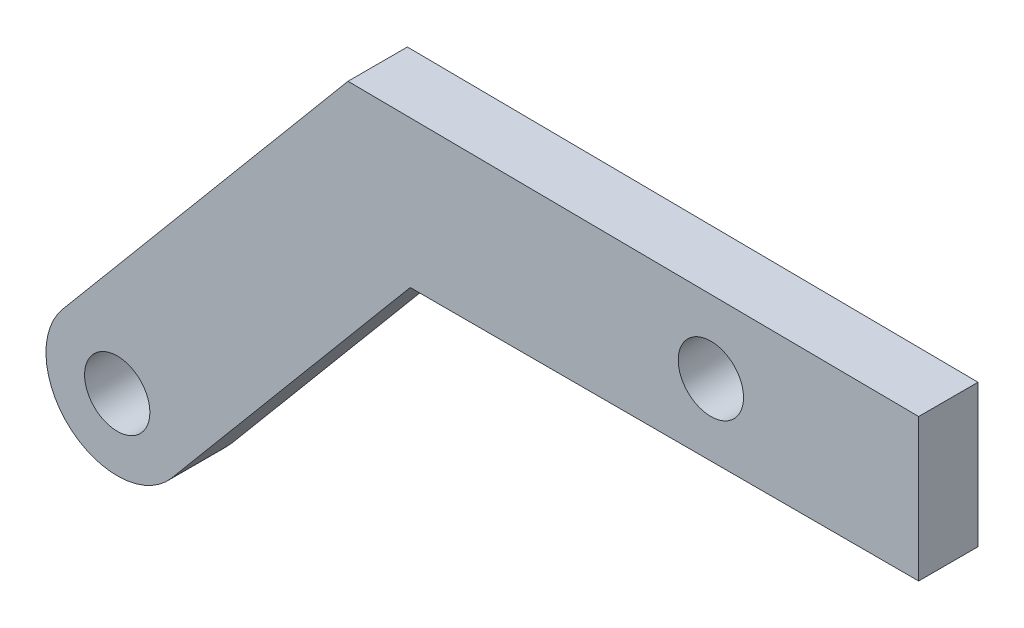
ISO-10303-21;
HEADER;
FILE_DESCRIPTION(('STEP AP214'),'2;1');
FILE_NAME('part.step','',(''),(''),'','','');
FILE_SCHEMA(('AUTOMOTIVE_DESIGN { 1 0 10303 214 1 1 1 1 }'));
ENDSEC;
DATA;
#1=APPLICATION_CONTEXT('core data for automotive mechanical design processes');
#2=APPLICATION_PROTOCOL_DEFINITION('international standard','automotive_design',2000,#1);
#3=PRODUCT_CONTEXT('',#1,'mechanical');
#4=PRODUCT('Part','Part','',(#3));
#5=PRODUCT_RELATED_PRODUCT_CATEGORY('part','',(#4));
#6=PRODUCT_DEFINITION_FORMATION('','',#4);
#7=PRODUCT_DEFINITION_CONTEXT('part definition',#1,'design');
#8=PRODUCT_DEFINITION('design','',#6,#7);
#9=PRODUCT_DEFINITION_SHAPE('','',#8);
#10=(LENGTH_UNIT() NAMED_UNIT(*) SI_UNIT(.MILLI.,.METRE.));
#11=(NAMED_UNIT(*) PLANE_ANGLE_UNIT() SI_UNIT($,.RADIAN.));
#12=(NAMED_UNIT(*) SI_UNIT($,.STERADIAN.) SOLID_ANGLE_UNIT());
#13=UNCERTAINTY_MEASURE_WITH_UNIT(LENGTH_MEASURE(1.E-05),#10,'distance_accuracy_value','');
#14=(GEOMETRIC_REPRESENTATION_CONTEXT(3) GLOBAL_UNCERTAINTY_ASSIGNED_CONTEXT((#13)) GLOBAL_UNIT_ASSIGNED_CONTEXT((#10,
#11,#12)) REPRESENTATION_CONTEXT('',''));
#15=CARTESIAN_POINT('',(0.,0.,0.));
#16=DIRECTION('',(0.,0.,1.));
#17=DIRECTION('',(1.,0.,0.));
#18=AXIS2_PLACEMENT_3D('',#15,#16,#17);
#19=CARTESIAN_POINT('',(0.,0.,10.));
#20=DIRECTION('',(0.,0.,1.));
#21=DIRECTION('',(1.,0.,0.));
#22=AXIS2_PLACEMENT_3D('',#19,#20,#21);
#23=PLANE('',#22);
#24=CARTESIAN_POINT('',(0.,0.,10.));
#25=DIRECTION('',(0.,0.,1.));
#26=DIRECTION('',(1.,0.,0.));
#27=AXIS2_PLACEMENT_3D('',#24,#25,#26);
#28=CIRCLE('',#27,5.5);
#29=CARTESIAN_POINT('',(5.5,0.,10.));
#30=VERTEX_POINT('',#29);
#31=EDGE_CURVE('E126',#30,#30,#28,.T.);
#32=ORIENTED_EDGE('',*,*,#31,.F.);
#33=EDGE_LOOP('',(#32));
#34=FACE_BOUND('',#33,.T.);
#35=CARTESIAN_POINT('',(0.,0.,10.));
#36=DIRECTION('',(0.,0.,1.));
#37=DIRECTION('',(1.,0.,0.));
#38=AXIS2_PLACEMENT_3D('',#35,#36,#37);
#39=CIRCLE('',#38,12.);
#40=CARTESIAN_POINT('',(-9.19253331742775,7.71345131623845,10.));
#41=VERTEX_POINT('',#40);
#42=CARTESIAN_POINT('',(9.19253331742775,-7.71345131623846,10.));
#43=VERTEX_POINT('',#42);
#44=EDGE_CURVE('E134',#41,#43,#39,.T.);
#45=ORIENTED_EDGE('',*,*,#44,.T.);
#46=DIRECTION('',(0.642787609686538,0.766044443118979,0.));
#47=VECTOR('',#46,1.);
#48=CARTESIAN_POINT('',(9.19253331742775,-7.71345131623846,10.));
#49=LINE('',#48,#47);
#50=CARTESIAN_POINT('',(49.357211477239,40.1529481761069,10.));
#51=VERTEX_POINT('',#50);
#52=EDGE_CURVE('E93',#43,#51,#49,.T.);
#53=ORIENTED_EDGE('',*,*,#52,.T.);
#54=DIRECTION('',(1.,0.,0.));
#55=VECTOR('',#54,1.);
#56=CARTESIAN_POINT('',(135.,40.152948176107,10.));
#57=LINE('',#56,#55);
#58=CARTESIAN_POINT('',(135.,40.152948176107,10.));
#59=VERTEX_POINT('',#58);
#60=EDGE_CURVE('E106',#51,#59,#57,.T.);
#61=ORIENTED_EDGE('',*,*,#60,.T.);
#62=DIRECTION('',(0.,1.,0.));
#63=VECTOR('',#62,1.);
#64=CARTESIAN_POINT('',(135.,64.1529481761069,10.));
#65=LINE('',#64,#63);
#66=CARTESIAN_POINT('',(135.,64.1529481761069,10.));
#67=VERTEX_POINT('',#66);
#68=EDGE_CURVE('E99',#59,#67,#65,.T.);
#69=ORIENTED_EDGE('',*,*,#68,.T.);
#70=DIRECTION('',(-0.9999611754595,0.00881178606499798,0.));
#71=VECTOR('',#70,1.);
#72=CARTESIAN_POINT('',(38.8765885545357,65.,10.));
#73=LINE('',#72,#71);
#74=CARTESIAN_POINT('',(38.8765885545357,65.,10.));
#75=VERTEX_POINT('',#74);
#76=EDGE_CURVE('E101',#67,#75,#73,.T.);
#77=ORIENTED_EDGE('',*,*,#76,.T.);
#78=DIRECTION('',(-0.642787609686538,-0.766044443118979,0.));
#79=VECTOR('',#78,1.);
#80=CARTESIAN_POINT('',(-9.19253331742775,7.71345131623845,10.));
#81=LINE('',#80,#79);
#82=EDGE_CURVE('E57',#75,#41,#81,.T.);
#83=ORIENTED_EDGE('',*,*,#82,.T.);
#84=EDGE_LOOP('',(#45,#53,#61,#69,#77,#83));
#85=FACE_BOUND('',#84,.T.);
#86=CARTESIAN_POINT('',(100.,52.152948176107,10.));
#87=DIRECTION('',(0.,0.,1.));
#88=DIRECTION('',(1.,0.,0.));
#89=AXIS2_PLACEMENT_3D('',#86,#87,#88);
#90=CIRCLE('',#89,5.5);
#91=CARTESIAN_POINT('',(105.5,52.152948176107,10.));
#92=VERTEX_POINT('',#91);
#93=EDGE_CURVE('E180',#92,#92,#90,.T.);
#94=ORIENTED_EDGE('',*,*,#93,.F.);
#95=EDGE_LOOP('',(#94));
#96=FACE_BOUND('',#95,.T.);
#97=ADVANCED_FACE('F39',(#34,#85,#96),#23,.T.);
#98=CARTESIAN_POINT('',(0.,0.,0.));
#99=DIRECTION('',(0.,0.,1.));
#100=DIRECTION('',(1.,0.,0.));
#101=AXIS2_PLACEMENT_3D('',#98,#99,#100);
#102=PLANE('',#101);
#103=CARTESIAN_POINT('',(0.,0.,0.));
#104=DIRECTION('',(0.,0.,1.));
#105=DIRECTION('',(1.,0.,0.));
#106=AXIS2_PLACEMENT_3D('',#103,#104,#105);
#107=CIRCLE('',#106,12.);
#108=CARTESIAN_POINT('',(-9.19253331742775,7.71345131623845,0.));
#109=VERTEX_POINT('',#108);
#110=CARTESIAN_POINT('',(9.19253331742775,-7.71345131623846,0.));
#111=VERTEX_POINT('',#110);
#112=EDGE_CURVE('E125',#109,#111,#107,.T.);
#113=ORIENTED_EDGE('',*,*,#112,.F.);
#114=DIRECTION('',(-0.642787609686538,-0.766044443118979,0.));
#115=VECTOR('',#114,1.);
#116=CARTESIAN_POINT('',(-9.19253331742775,7.71345131623845,0.));
#117=LINE('',#116,#115);
#118=CARTESIAN_POINT('',(38.8765885545357,65.,0.));
#119=VERTEX_POINT('',#118);
#120=EDGE_CURVE('E82',#119,#109,#117,.T.);
#121=ORIENTED_EDGE('',*,*,#120,.F.);
#122=DIRECTION('',(-0.9999611754595,0.00881178606499798,0.));
#123=VECTOR('',#122,1.);
#124=CARTESIAN_POINT('',(38.8765885545357,65.,0.));
#125=LINE('',#124,#123);
#126=CARTESIAN_POINT('',(135.,64.1529481761069,0.));
#127=VERTEX_POINT('',#126);
#128=EDGE_CURVE('E80',#127,#119,#125,.T.);
#129=ORIENTED_EDGE('',*,*,#128,.F.);
#130=DIRECTION('',(0.,1.,0.));
#131=VECTOR('',#130,1.);
#132=CARTESIAN_POINT('',(135.,64.1529481761069,0.));
#133=LINE('',#132,#131);
#134=CARTESIAN_POINT('',(135.,40.152948176107,0.));
#135=VERTEX_POINT('',#134);
#136=EDGE_CURVE('E114',#135,#127,#133,.T.);
#137=ORIENTED_EDGE('',*,*,#136,.F.);
#138=DIRECTION('',(1.,0.,0.));
#139=VECTOR('',#138,1.);
#140=CARTESIAN_POINT('',(135.,40.152948176107,0.));
#141=LINE('',#140,#139);
#142=CARTESIAN_POINT('',(49.357211477239,40.1529481761069,0.));
#143=VERTEX_POINT('',#142);
#144=EDGE_CURVE('E127',#143,#135,#141,.T.);
#145=ORIENTED_EDGE('',*,*,#144,.F.);
#146=DIRECTION('',(0.642787609686538,0.766044443118979,0.));
#147=VECTOR('',#146,1.);
#148=CARTESIAN_POINT('',(39.7116071613007,28.6577645798453,0.));
#149=LINE('',#148,#147);
#150=EDGE_CURVE('E130',#111,#143,#149,.T.);
#151=ORIENTED_EDGE('',*,*,#150,.F.);
#152=EDGE_LOOP('',(#113,#121,#129,#137,#145,#151));
#153=FACE_BOUND('',#152,.T.);
#154=CARTESIAN_POINT('',(0.,0.,0.));
#155=DIRECTION('',(0.,0.,1.));
#156=DIRECTION('',(1.,0.,0.));
#157=AXIS2_PLACEMENT_3D('',#154,#155,#156);
#158=CIRCLE('',#157,5.5);
#159=CARTESIAN_POINT('',(5.5,0.,0.));
#160=VERTEX_POINT('',#159);
#161=EDGE_CURVE('E183',#160,#160,#158,.T.);
#162=ORIENTED_EDGE('',*,*,#161,.T.);
#163=EDGE_LOOP('',(#162));
#164=FACE_BOUND('',#163,.T.);
#165=CARTESIAN_POINT('',(100.,52.152948176107,0.));
#166=DIRECTION('',(0.,0.,1.));
#167=DIRECTION('',(1.,0.,0.));
#168=AXIS2_PLACEMENT_3D('',#165,#166,#167);
#169=CIRCLE('',#168,5.5);
#170=CARTESIAN_POINT('',(105.5,52.152948176107,0.));
#171=VERTEX_POINT('',#170);
#172=EDGE_CURVE('E179',#171,#171,#169,.T.);
#173=ORIENTED_EDGE('',*,*,#172,.T.);
#174=EDGE_LOOP('',(#173));
#175=FACE_BOUND('',#174,.T.);
#176=ADVANCED_FACE('F143',(#153,#164,#175),#102,.F.);
#177=CARTESIAN_POINT('',(0.,0.,10.));
#178=DIRECTION('',(0.,0.,-1.));
#179=DIRECTION('',(-1.,0.,0.));
#180=AXIS2_PLACEMENT_3D('',#177,#178,#179);
#181=CYLINDRICAL_SURFACE('',#180,12.);
#182=ORIENTED_EDGE('',*,*,#112,.T.);
#183=DIRECTION('',(0.,0.,-1.));
#184=VECTOR('',#183,1.);
#185=CARTESIAN_POINT('',(9.19253331742775,-7.71345131623846,10.));
#186=LINE('',#185,#184);
#187=EDGE_CURVE('E11',#43,#111,#186,.T.);
#188=ORIENTED_EDGE('',*,*,#187,.F.);
#189=ORIENTED_EDGE('',*,*,#44,.F.);
#190=DIRECTION('',(0.,0.,-1.));
#191=VECTOR('',#190,1.);
#192=CARTESIAN_POINT('',(-9.19253331742775,7.71345131623845,10.));
#193=LINE('',#192,#191);
#194=EDGE_CURVE('E120',#41,#109,#193,.T.);
#195=ORIENTED_EDGE('',*,*,#194,.T.);
#196=EDGE_LOOP('',(#182,#188,#189,#195));
#197=FACE_BOUND('',#196,.T.);
#198=ADVANCED_FACE('F41',(#197),#181,.T.);
#199=CARTESIAN_POINT('',(39.7116071613007,28.6577645798453,10.));
#200=DIRECTION('',(-0.766044443118979,0.642787609686538,0.));
#201=DIRECTION('',(-0.642787609686538,-0.766044443118979,0.));
#202=AXIS2_PLACEMENT_3D('',#199,#200,#201);
#203=PLANE('',#202);
#204=ORIENTED_EDGE('',*,*,#150,.T.);
#205=DIRECTION('',(0.,0.,-1.));
#206=VECTOR('',#205,1.);
#207=CARTESIAN_POINT('',(49.357211477239,40.1529481761069,10.));
#208=LINE('',#207,#206);
#209=EDGE_CURVE('E48',#51,#143,#208,.T.);
#210=ORIENTED_EDGE('',*,*,#209,.F.);
#211=ORIENTED_EDGE('',*,*,#52,.F.);
#212=ORIENTED_EDGE('',*,*,#187,.T.);
#213=EDGE_LOOP('',(#204,#210,#211,#212));
#214=FACE_BOUND('',#213,.T.);
#215=ADVANCED_FACE('F226',(#214),#203,.F.);
#216=CARTESIAN_POINT('',(135.,40.152948176107,10.));
#217=DIRECTION('',(0.,1.,0.));
#218=DIRECTION('',(-1.,0.,0.));
#219=AXIS2_PLACEMENT_3D('',#216,#217,#218);
#220=PLANE('',#219);
#221=ORIENTED_EDGE('',*,*,#144,.T.);
#222=DIRECTION('',(0.,0.,-1.));
#223=VECTOR('',#222,1.);
#224=CARTESIAN_POINT('',(135.,40.152948176107,10.));
#225=LINE('',#224,#223);
#226=EDGE_CURVE('E113',#59,#135,#225,.T.);
#227=ORIENTED_EDGE('',*,*,#226,.F.);
#228=ORIENTED_EDGE('',*,*,#60,.F.);
#229=ORIENTED_EDGE('',*,*,#209,.T.);
#230=EDGE_LOOP('',(#221,#227,#228,#229));
#231=FACE_BOUND('',#230,.T.);
#232=ADVANCED_FACE('F141',(#231),#220,.F.);
#233=CARTESIAN_POINT('',(135.,64.1529481761069,10.));
#234=DIRECTION('',(-1.,0.,0.));
#235=DIRECTION('',(0.,0.,1.));
#236=AXIS2_PLACEMENT_3D('',#233,#234,#235);
#237=PLANE('',#236);
#238=ORIENTED_EDGE('',*,*,#136,.T.);
#239=DIRECTION('',(0.,0.,-1.));
#240=VECTOR('',#239,1.);
#241=CARTESIAN_POINT('',(135.,64.1529481761069,10.));
#242=LINE('',#241,#240);
#243=EDGE_CURVE('E112',#67,#127,#242,.T.);
#244=ORIENTED_EDGE('',*,*,#243,.F.);
#245=ORIENTED_EDGE('',*,*,#68,.F.);
#246=ORIENTED_EDGE('',*,*,#226,.T.);
#247=EDGE_LOOP('',(#238,#244,#245,#246));
#248=FACE_BOUND('',#247,.T.);
#249=ADVANCED_FACE('F115',(#248),#237,.F.);
#250=CARTESIAN_POINT('',(38.8765885545357,65.,10.));
#251=DIRECTION('',(-0.00881178606499798,-0.9999611754595,0.));
#252=DIRECTION('',(0.9999611754595,-0.00881178606499798,0.));
#253=AXIS2_PLACEMENT_3D('',#250,#251,#252);
#254=PLANE('',#253);
#255=ORIENTED_EDGE('',*,*,#128,.T.);
#256=DIRECTION('',(0.,0.,-1.));
#257=VECTOR('',#256,1.);
#258=CARTESIAN_POINT('',(38.8765885545357,65.,10.));
#259=LINE('',#258,#257);
#260=EDGE_CURVE('E116',#75,#119,#259,.T.);
#261=ORIENTED_EDGE('',*,*,#260,.F.);
#262=ORIENTED_EDGE('',*,*,#76,.F.);
#263=ORIENTED_EDGE('',*,*,#243,.T.);
#264=EDGE_LOOP('',(#255,#261,#262,#263));
#265=FACE_BOUND('',#264,.T.);
#266=ADVANCED_FACE('F119',(#265),#254,.F.);
#267=CARTESIAN_POINT('',(-9.19253331742775,7.71345131623845,10.));
#268=DIRECTION('',(0.766044443118979,-0.642787609686538,0.));
#269=DIRECTION('',(0.642787609686538,0.766044443118979,0.));
#270=AXIS2_PLACEMENT_3D('',#267,#268,#269);
#271=PLANE('',#270);
#272=ORIENTED_EDGE('',*,*,#120,.T.);
#273=ORIENTED_EDGE('',*,*,#194,.F.);
#274=ORIENTED_EDGE('',*,*,#82,.F.);
#275=ORIENTED_EDGE('',*,*,#260,.T.);
#276=EDGE_LOOP('',(#272,#273,#274,#275));
#277=FACE_BOUND('',#276,.T.);
#278=ADVANCED_FACE('F146',(#277),#271,.F.);
#279=CARTESIAN_POINT('',(0.,0.,10.));
#280=DIRECTION('',(0.,0.,-1.));
#281=DIRECTION('',(-1.,0.,0.));
#282=AXIS2_PLACEMENT_3D('',#279,#280,#281);
#283=CYLINDRICAL_SURFACE('',#282,5.5);
#284=ORIENTED_EDGE('',*,*,#31,.T.);
#285=EDGE_LOOP('',(#284));
#286=FACE_BOUND('',#285,.T.);
#287=ORIENTED_EDGE('',*,*,#161,.F.);
#288=EDGE_LOOP('',(#287));
#289=FACE_BOUND('',#288,.T.);
#290=ADVANCED_FACE('F151',(#286,#289),#283,.F.);
#291=CARTESIAN_POINT('',(100.,52.152948176107,10.));
#292=DIRECTION('',(0.,0.,-1.));
#293=DIRECTION('',(-1.,0.,0.));
#294=AXIS2_PLACEMENT_3D('',#291,#292,#293);
#295=CYLINDRICAL_SURFACE('',#294,5.5);
#296=ORIENTED_EDGE('',*,*,#93,.T.);
#297=EDGE_LOOP('',(#296));
#298=FACE_BOUND('',#297,.T.);
#299=ORIENTED_EDGE('',*,*,#172,.F.);
#300=EDGE_LOOP('',(#299));
#301=FACE_BOUND('',#300,.T.);
#302=ADVANCED_FACE('F160',(#298,#301),#295,.F.);
#303=CLOSED_SHELL('',(#97,#176,#198,#215,#232,#249,#266,#278,#290,#302));
#304=MANIFOLD_SOLID_BREP('B2',#303);
#305=ADVANCED_BREP_SHAPE_REPRESENTATION('',(#18,#304),#14);
#306=SHAPE_DEFINITION_REPRESENTATION(#9,#305);
ENDSEC;
END-ISO-10303-21;
